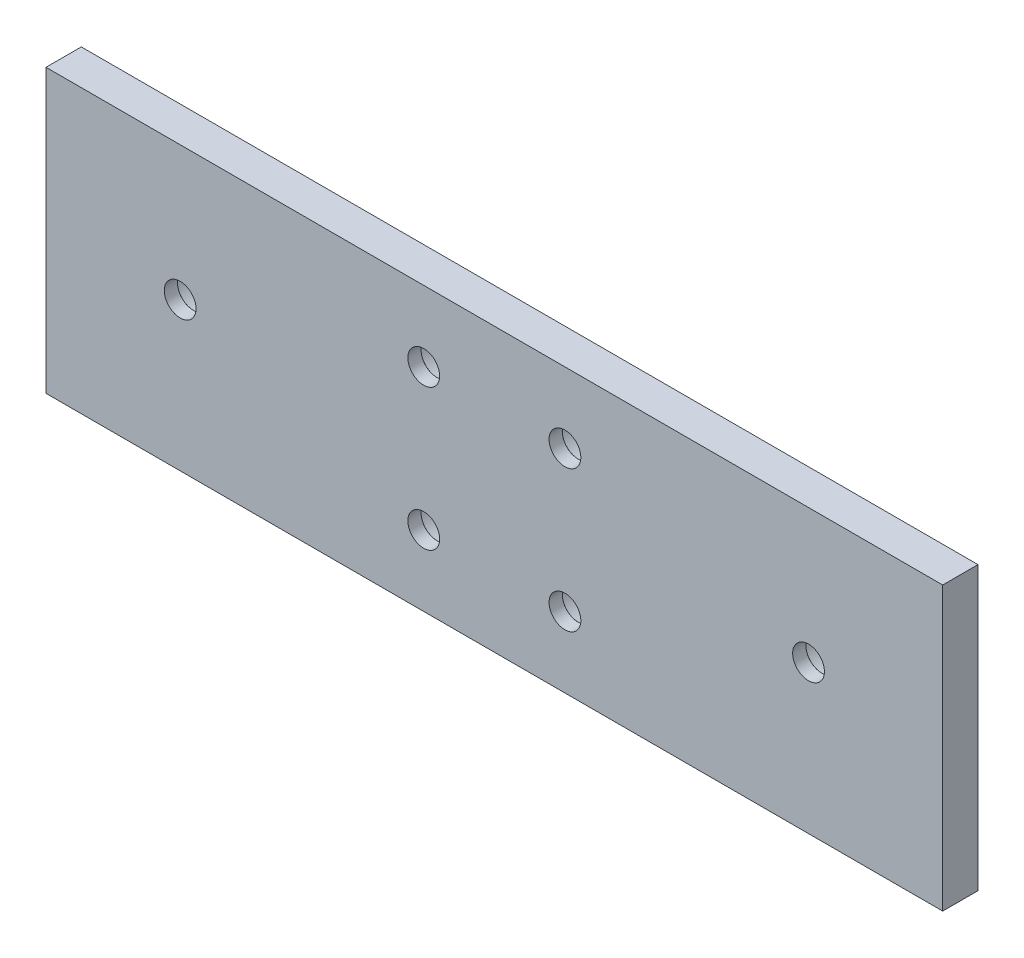
ISO-10303-21;
HEADER;
FILE_DESCRIPTION(('STEP AP214'),'2;1');
FILE_NAME('part.step','',(''),(''),'','','');
FILE_SCHEMA(('AUTOMOTIVE_DESIGN { 1 0 10303 214 1 1 1 1 }'));
ENDSEC;
DATA;
#1=APPLICATION_CONTEXT('core data for automotive mechanical design processes');
#2=APPLICATION_PROTOCOL_DEFINITION('international standard','automotive_design',2000,#1);
#3=PRODUCT_CONTEXT('',#1,'mechanical');
#4=PRODUCT('Part','Part','',(#3));
#5=PRODUCT_RELATED_PRODUCT_CATEGORY('part','',(#4));
#6=PRODUCT_DEFINITION_FORMATION('','',#4);
#7=PRODUCT_DEFINITION_CONTEXT('part definition',#1,'design');
#8=PRODUCT_DEFINITION('design','',#6,#7);
#9=PRODUCT_DEFINITION_SHAPE('','',#8);
#10=(LENGTH_UNIT() NAMED_UNIT(*) SI_UNIT(.MILLI.,.METRE.));
#11=(NAMED_UNIT(*) PLANE_ANGLE_UNIT() SI_UNIT($,.RADIAN.));
#12=(NAMED_UNIT(*) SI_UNIT($,.STERADIAN.) SOLID_ANGLE_UNIT());
#13=UNCERTAINTY_MEASURE_WITH_UNIT(LENGTH_MEASURE(1.E-05),#10,'distance_accuracy_value','');
#14=(GEOMETRIC_REPRESENTATION_CONTEXT(3) GLOBAL_UNCERTAINTY_ASSIGNED_CONTEXT((#13)) GLOBAL_UNIT_ASSIGNED_CONTEXT((#10,
#11,#12)) REPRESENTATION_CONTEXT('',''));
#15=CARTESIAN_POINT('',(0.,0.,0.));
#16=DIRECTION('',(0.,0.,1.));
#17=DIRECTION('',(1.,0.,0.));
#18=AXIS2_PLACEMENT_3D('',#15,#16,#17);
#19=CARTESIAN_POINT('',(63.5,-20.,5.));
#20=DIRECTION('',(-1.,0.,0.));
#21=DIRECTION('',(0.,0.,1.));
#22=AXIS2_PLACEMENT_3D('',#19,#20,#21);
#23=PLANE('',#22);
#24=DIRECTION('',(0.,1.,0.));
#25=VECTOR('',#24,1.);
#26=CARTESIAN_POINT('',(63.5,-20.,0.));
#27=LINE('',#26,#25);
#28=CARTESIAN_POINT('',(63.5,-20.,0.));
#29=VERTEX_POINT('',#28);
#30=CARTESIAN_POINT('',(63.5,20.,0.));
#31=VERTEX_POINT('',#30);
#32=EDGE_CURVE('E97',#29,#31,#27,.T.);
#33=ORIENTED_EDGE('',*,*,#32,.T.);
#34=DIRECTION('',(0.,0.,-1.));
#35=VECTOR('',#34,1.);
#36=CARTESIAN_POINT('',(63.5,20.,5.));
#37=LINE('',#36,#35);
#38=CARTESIAN_POINT('',(63.5,20.,5.));
#39=VERTEX_POINT('',#38);
#40=EDGE_CURVE('E11',#39,#31,#37,.T.);
#41=ORIENTED_EDGE('',*,*,#40,.F.);
#42=DIRECTION('',(0.,1.,0.));
#43=VECTOR('',#42,1.);
#44=CARTESIAN_POINT('',(63.5,-20.,5.));
#45=LINE('',#44,#43);
#46=CARTESIAN_POINT('',(63.5,-20.,5.));
#47=VERTEX_POINT('',#46);
#48=EDGE_CURVE('E85',#47,#39,#45,.T.);
#49=ORIENTED_EDGE('',*,*,#48,.F.);
#50=DIRECTION('',(0.,0.,-1.));
#51=VECTOR('',#50,1.);
#52=CARTESIAN_POINT('',(63.5,-20.,5.));
#53=LINE('',#52,#51);
#54=EDGE_CURVE('E93',#47,#29,#53,.T.);
#55=ORIENTED_EDGE('',*,*,#54,.T.);
#56=EDGE_LOOP('',(#33,#41,#49,#55));
#57=FACE_BOUND('',#56,.T.);
#58=ADVANCED_FACE('F34',(#57),#23,.F.);
#59=CARTESIAN_POINT('',(-63.5,20.,5.));
#60=DIRECTION('',(0.,-1.,0.));
#61=DIRECTION('',(0.,0.,-1.));
#62=AXIS2_PLACEMENT_3D('',#59,#60,#61);
#63=PLANE('',#62);
#64=DIRECTION('',(-1.,0.,0.));
#65=VECTOR('',#64,1.);
#66=CARTESIAN_POINT('',(-63.5,20.,0.));
#67=LINE('',#66,#65);
#68=CARTESIAN_POINT('',(-63.5,20.,0.));
#69=VERTEX_POINT('',#68);
#70=EDGE_CURVE('E89',#31,#69,#67,.T.);
#71=ORIENTED_EDGE('',*,*,#70,.T.);
#72=DIRECTION('',(0.,0.,-1.));
#73=VECTOR('',#72,1.);
#74=CARTESIAN_POINT('',(-63.5,20.,5.));
#75=LINE('',#74,#73);
#76=CARTESIAN_POINT('',(-63.5,20.,5.));
#77=VERTEX_POINT('',#76);
#78=EDGE_CURVE('E42',#77,#69,#75,.T.);
#79=ORIENTED_EDGE('',*,*,#78,.F.);
#80=DIRECTION('',(-1.,0.,0.));
#81=VECTOR('',#80,1.);
#82=CARTESIAN_POINT('',(-63.5,20.,5.));
#83=LINE('',#82,#81);
#84=EDGE_CURVE('E80',#39,#77,#83,.T.);
#85=ORIENTED_EDGE('',*,*,#84,.F.);
#86=ORIENTED_EDGE('',*,*,#40,.T.);
#87=EDGE_LOOP('',(#71,#79,#85,#86));
#88=FACE_BOUND('',#87,.T.);
#89=ADVANCED_FACE('F88',(#88),#63,.F.);
#90=CARTESIAN_POINT('',(-63.5,-20.,5.));
#91=DIRECTION('',(1.,0.,0.));
#92=DIRECTION('',(0.,0.,-1.));
#93=AXIS2_PLACEMENT_3D('',#90,#91,#92);
#94=PLANE('',#93);
#95=DIRECTION('',(0.,-1.,0.));
#96=VECTOR('',#95,1.);
#97=CARTESIAN_POINT('',(-63.5,-20.,0.));
#98=LINE('',#97,#96);
#99=CARTESIAN_POINT('',(-63.5,-20.,0.));
#100=VERTEX_POINT('',#99);
#101=EDGE_CURVE('E67',#69,#100,#98,.T.);
#102=ORIENTED_EDGE('',*,*,#101,.T.);
#103=DIRECTION('',(0.,0.,-1.));
#104=VECTOR('',#103,1.);
#105=CARTESIAN_POINT('',(-63.5,-20.,5.));
#106=LINE('',#105,#104);
#107=CARTESIAN_POINT('',(-63.5,-20.,5.));
#108=VERTEX_POINT('',#107);
#109=EDGE_CURVE('E90',#108,#100,#106,.T.);
#110=ORIENTED_EDGE('',*,*,#109,.F.);
#111=DIRECTION('',(0.,-1.,0.));
#112=VECTOR('',#111,1.);
#113=CARTESIAN_POINT('',(-63.5,-20.,5.));
#114=LINE('',#113,#112);
#115=EDGE_CURVE('E83',#77,#108,#114,.T.);
#116=ORIENTED_EDGE('',*,*,#115,.F.);
#117=ORIENTED_EDGE('',*,*,#78,.T.);
#118=EDGE_LOOP('',(#102,#110,#116,#117));
#119=FACE_BOUND('',#118,.T.);
#120=ADVANCED_FACE('F91',(#119),#94,.F.);
#121=CARTESIAN_POINT('',(-63.5,-20.,5.));
#122=DIRECTION('',(0.,1.,0.));
#123=DIRECTION('',(0.,0.,1.));
#124=AXIS2_PLACEMENT_3D('',#121,#122,#123);
#125=PLANE('',#124);
#126=DIRECTION('',(1.,0.,0.));
#127=VECTOR('',#126,1.);
#128=CARTESIAN_POINT('',(-63.5,-20.,0.));
#129=LINE('',#128,#127);
#130=EDGE_CURVE('E73',#100,#29,#129,.T.);
#131=ORIENTED_EDGE('',*,*,#130,.T.);
#132=ORIENTED_EDGE('',*,*,#54,.F.);
#133=DIRECTION('',(1.,0.,0.));
#134=VECTOR('',#133,1.);
#135=CARTESIAN_POINT('',(-63.5,-20.,5.));
#136=LINE('',#135,#134);
#137=EDGE_CURVE('E50',#108,#47,#136,.T.);
#138=ORIENTED_EDGE('',*,*,#137,.F.);
#139=ORIENTED_EDGE('',*,*,#109,.T.);
#140=EDGE_LOOP('',(#131,#132,#138,#139));
#141=FACE_BOUND('',#140,.T.);
#142=ADVANCED_FACE('F105',(#141),#125,.F.);
#143=CARTESIAN_POINT('',(0.,0.,5.));
#144=DIRECTION('',(0.,0.,-1.));
#145=DIRECTION('',(-1.,0.,0.));
#146=AXIS2_PLACEMENT_3D('',#143,#144,#145);
#147=PLANE('',#146);
#148=CARTESIAN_POINT('',(9.99999999999822,-9.99999999999679,5.));
#149=DIRECTION('',(0.,0.,-1.));
#150=DIRECTION('',(-1.,0.,0.));
#151=AXIS2_PLACEMENT_3D('',#148,#149,#150);
#152=CIRCLE('',#151,2.25);
#153=CARTESIAN_POINT('',(7.74999999999822,-9.99999999999679,5.));
#154=VERTEX_POINT('',#153);
#155=EDGE_CURVE('E185',#154,#154,#152,.T.);
#156=ORIENTED_EDGE('',*,*,#155,.T.);
#157=EDGE_LOOP('',(#156));
#158=FACE_BOUND('',#157,.T.);
#159=CARTESIAN_POINT('',(9.99999999999841,10.0000000000032,5.));
#160=DIRECTION('',(0.,0.,-1.));
#161=DIRECTION('',(-1.,0.,0.));
#162=AXIS2_PLACEMENT_3D('',#159,#160,#161);
#163=CIRCLE('',#162,2.25);
#164=CARTESIAN_POINT('',(7.74999999999841,10.0000000000032,5.));
#165=VERTEX_POINT('',#164);
#166=EDGE_CURVE('E170',#165,#165,#163,.T.);
#167=ORIENTED_EDGE('',*,*,#166,.T.);
#168=EDGE_LOOP('',(#167));
#169=FACE_BOUND('',#168,.T.);
#170=CARTESIAN_POINT('',(-10.0000000000018,-9.99999999999661,5.));
#171=DIRECTION('',(0.,0.,-1.));
#172=DIRECTION('',(-1.,0.,0.));
#173=AXIS2_PLACEMENT_3D('',#170,#171,#172);
#174=CIRCLE('',#173,2.25);
#175=CARTESIAN_POINT('',(-12.2500000000018,-9.99999999999661,5.));
#176=VERTEX_POINT('',#175);
#177=EDGE_CURVE('E155',#176,#176,#174,.T.);
#178=ORIENTED_EDGE('',*,*,#177,.T.);
#179=EDGE_LOOP('',(#178));
#180=FACE_BOUND('',#179,.T.);
#181=CARTESIAN_POINT('',(-10.0000000000016,10.0000000000034,5.));
#182=DIRECTION('',(0.,0.,-1.));
#183=DIRECTION('',(-1.,0.,0.));
#184=AXIS2_PLACEMENT_3D('',#181,#182,#183);
#185=CIRCLE('',#184,2.25);
#186=CARTESIAN_POINT('',(-12.2500000000016,10.0000000000034,5.));
#187=VERTEX_POINT('',#186);
#188=EDGE_CURVE('E140',#187,#187,#185,.T.);
#189=ORIENTED_EDGE('',*,*,#188,.T.);
#190=EDGE_LOOP('',(#189));
#191=FACE_BOUND('',#190,.T.);
#192=CARTESIAN_POINT('',(44.4999999999907,1.00000000000008,5.));
#193=DIRECTION('',(0.,0.,-1.));
#194=DIRECTION('',(-1.,0.,0.));
#195=AXIS2_PLACEMENT_3D('',#192,#193,#194);
#196=CIRCLE('',#195,2.25);
#197=CARTESIAN_POINT('',(42.2499999999907,1.00000000000008,5.));
#198=VERTEX_POINT('',#197);
#199=EDGE_CURVE('E125',#198,#198,#196,.T.);
#200=ORIENTED_EDGE('',*,*,#199,.T.);
#201=EDGE_LOOP('',(#200));
#202=FACE_BOUND('',#201,.T.);
#203=CARTESIAN_POINT('',(-44.5000000000093,0.999999999999977,5.));
#204=DIRECTION('',(0.,0.,-1.));
#205=DIRECTION('',(-1.,0.,0.));
#206=AXIS2_PLACEMENT_3D('',#203,#204,#205);
#207=CIRCLE('',#206,2.25);
#208=CARTESIAN_POINT('',(-46.7500000000093,0.999999999999977,5.));
#209=VERTEX_POINT('',#208);
#210=EDGE_CURVE('E100',#209,#209,#207,.T.);
#211=ORIENTED_EDGE('',*,*,#210,.T.);
#212=EDGE_LOOP('',(#211));
#213=FACE_BOUND('',#212,.T.);
#214=ORIENTED_EDGE('',*,*,#48,.T.);
#215=ORIENTED_EDGE('',*,*,#84,.T.);
#216=ORIENTED_EDGE('',*,*,#115,.T.);
#217=ORIENTED_EDGE('',*,*,#137,.T.);
#218=EDGE_LOOP('',(#214,#215,#216,#217));
#219=FACE_BOUND('',#218,.T.);
#220=ADVANCED_FACE('F81',(#158,#169,#180,#191,#202,#213,#219),#147,.F.);
#221=CARTESIAN_POINT('',(0.,0.,0.));
#222=DIRECTION('',(0.,0.,-1.));
#223=DIRECTION('',(-1.,0.,0.));
#224=AXIS2_PLACEMENT_3D('',#221,#222,#223);
#225=PLANE('',#224);
#226=CARTESIAN_POINT('',(9.99999999999822,-9.99999999999679,0.));
#227=DIRECTION('',(0.,0.,-1.));
#228=DIRECTION('',(-1.,0.,0.));
#229=AXIS2_PLACEMENT_3D('',#226,#227,#228);
#230=CIRCLE('',#229,4.49999999999999);
#231=CARTESIAN_POINT('',(5.49999999999823,-9.99999999999679,0.));
#232=VERTEX_POINT('',#231);
#233=EDGE_CURVE('E197',#232,#232,#230,.T.);
#234=ORIENTED_EDGE('',*,*,#233,.F.);
#235=EDGE_LOOP('',(#234));
#236=FACE_BOUND('',#235,.T.);
#237=CARTESIAN_POINT('',(9.99999999999841,10.0000000000032,0.));
#238=DIRECTION('',(0.,0.,-1.));
#239=DIRECTION('',(-1.,0.,0.));
#240=AXIS2_PLACEMENT_3D('',#237,#238,#239);
#241=CIRCLE('',#240,4.49999999999999);
#242=CARTESIAN_POINT('',(5.49999999999841,10.0000000000032,0.));
#243=VERTEX_POINT('',#242);
#244=EDGE_CURVE('E182',#243,#243,#241,.T.);
#245=ORIENTED_EDGE('',*,*,#244,.F.);
#246=EDGE_LOOP('',(#245));
#247=FACE_BOUND('',#246,.T.);
#248=CARTESIAN_POINT('',(-10.0000000000018,-9.99999999999661,0.));
#249=DIRECTION('',(0.,0.,-1.));
#250=DIRECTION('',(-1.,0.,0.));
#251=AXIS2_PLACEMENT_3D('',#248,#249,#250);
#252=CIRCLE('',#251,4.49999999999999);
#253=CARTESIAN_POINT('',(-14.5000000000018,-9.99999999999661,0.));
#254=VERTEX_POINT('',#253);
#255=EDGE_CURVE('E167',#254,#254,#252,.T.);
#256=ORIENTED_EDGE('',*,*,#255,.F.);
#257=EDGE_LOOP('',(#256));
#258=FACE_BOUND('',#257,.T.);
#259=CARTESIAN_POINT('',(-10.0000000000016,10.0000000000034,0.));
#260=DIRECTION('',(0.,0.,-1.));
#261=DIRECTION('',(-1.,0.,0.));
#262=AXIS2_PLACEMENT_3D('',#259,#260,#261);
#263=CIRCLE('',#262,4.49999999999999);
#264=CARTESIAN_POINT('',(-14.5000000000016,10.0000000000034,0.));
#265=VERTEX_POINT('',#264);
#266=EDGE_CURVE('E152',#265,#265,#263,.T.);
#267=ORIENTED_EDGE('',*,*,#266,.F.);
#268=EDGE_LOOP('',(#267));
#269=FACE_BOUND('',#268,.T.);
#270=CARTESIAN_POINT('',(44.4999999999907,1.00000000000008,0.));
#271=DIRECTION('',(0.,0.,-1.));
#272=DIRECTION('',(-1.,0.,0.));
#273=AXIS2_PLACEMENT_3D('',#270,#271,#272);
#274=CIRCLE('',#273,4.5);
#275=CARTESIAN_POINT('',(39.9999999999907,1.00000000000008,0.));
#276=VERTEX_POINT('',#275);
#277=EDGE_CURVE('E137',#276,#276,#274,.T.);
#278=ORIENTED_EDGE('',*,*,#277,.F.);
#279=EDGE_LOOP('',(#278));
#280=FACE_BOUND('',#279,.T.);
#281=CARTESIAN_POINT('',(-44.5000000000093,0.999999999999977,0.));
#282=DIRECTION('',(0.,0.,-1.));
#283=DIRECTION('',(-1.,0.,0.));
#284=AXIS2_PLACEMENT_3D('',#281,#282,#283);
#285=CIRCLE('',#284,4.5);
#286=CARTESIAN_POINT('',(-49.0000000000093,0.999999999999977,0.));
#287=VERTEX_POINT('',#286);
#288=EDGE_CURVE('E122',#287,#287,#285,.T.);
#289=ORIENTED_EDGE('',*,*,#288,.F.);
#290=EDGE_LOOP('',(#289));
#291=FACE_BOUND('',#290,.T.);
#292=ORIENTED_EDGE('',*,*,#32,.F.);
#293=ORIENTED_EDGE('',*,*,#130,.F.);
#294=ORIENTED_EDGE('',*,*,#101,.F.);
#295=ORIENTED_EDGE('',*,*,#70,.F.);
#296=EDGE_LOOP('',(#292,#293,#294,#295));
#297=FACE_BOUND('',#296,.T.);
#298=ADVANCED_FACE('F108',(#236,#247,#258,#269,#280,#291,#297),#225,.T.);
#299=CARTESIAN_POINT('',(-44.5000000000093,0.999999999999977,0.));
#300=DIRECTION('',(0.,0.,-1.));
#301=DIRECTION('',(-1.,0.,0.));
#302=AXIS2_PLACEMENT_3D('',#299,#300,#301);
#303=CYLINDRICAL_SURFACE('',#302,2.25);
#304=ORIENTED_EDGE('',*,*,#210,.F.);
#305=EDGE_LOOP('',(#304));
#306=FACE_BOUND('',#305,.T.);
#307=CARTESIAN_POINT('',(-44.5000000000093,0.999999999999977,3.125));
#308=DIRECTION('',(0.,0.,-1.));
#309=DIRECTION('',(-1.,0.,0.));
#310=AXIS2_PLACEMENT_3D('',#307,#308,#309);
#311=CIRCLE('',#310,2.25);
#312=CARTESIAN_POINT('',(-46.7500000000093,0.999999999999977,3.125));
#313=VERTEX_POINT('',#312);
#314=EDGE_CURVE('E113',#313,#313,#311,.T.);
#315=ORIENTED_EDGE('',*,*,#314,.T.);
#316=EDGE_LOOP('',(#315));
#317=FACE_BOUND('',#316,.T.);
#318=ADVANCED_FACE('F205',(#306,#317),#303,.F.);
#319=CARTESIAN_POINT('',(-44.5000000000093,0.999999999999977,3.1));
#320=DIRECTION('',(0.,0.,-1.));
#321=DIRECTION('',(-1.,0.,0.));
#322=AXIS2_PLACEMENT_3D('',#319,#320,#321);
#323=CONICAL_SURFACE('',#322,2.275,0.78539816339744);
#324=ORIENTED_EDGE('',*,*,#314,.F.);
#325=EDGE_LOOP('',(#324));
#326=FACE_BOUND('',#325,.T.);
#327=CARTESIAN_POINT('',(-44.5000000000093,0.999999999999977,3.1));
#328=DIRECTION('',(0.,0.,-1.));
#329=DIRECTION('',(-1.,0.,0.));
#330=AXIS2_PLACEMENT_3D('',#327,#328,#329);
#331=CIRCLE('',#330,2.275);
#332=CARTESIAN_POINT('',(-46.7750000000093,0.999999999999977,3.1));
#333=VERTEX_POINT('',#332);
#334=EDGE_CURVE('E116',#333,#333,#331,.T.);
#335=ORIENTED_EDGE('',*,*,#334,.T.);
#336=EDGE_LOOP('',(#335));
#337=FACE_BOUND('',#336,.T.);
#338=ADVANCED_FACE('F230',(#326,#337),#323,.F.);
#339=CARTESIAN_POINT('',(-42.2250000000093,0.999999999999977,3.1));
#340=DIRECTION('',(0.,0.,1.));
#341=DIRECTION('',(1.,0.,0.));
#342=AXIS2_PLACEMENT_3D('',#339,#340,#341);
#343=PLANE('',#342);
#344=ORIENTED_EDGE('',*,*,#334,.F.);
#345=EDGE_LOOP('',(#344));
#346=FACE_BOUND('',#345,.T.);
#347=CARTESIAN_POINT('',(-44.5000000000093,0.999999999999977,3.1));
#348=DIRECTION('',(0.,0.,-1.));
#349=DIRECTION('',(-1.,0.,0.));
#350=AXIS2_PLACEMENT_3D('',#347,#348,#349);
#351=CIRCLE('',#350,4.5);
#352=CARTESIAN_POINT('',(-49.0000000000093,0.999999999999977,3.1));
#353=VERTEX_POINT('',#352);
#354=EDGE_CURVE('E119',#353,#353,#351,.T.);
#355=ORIENTED_EDGE('',*,*,#354,.T.);
#356=EDGE_LOOP('',(#355));
#357=FACE_BOUND('',#356,.T.);
#358=ADVANCED_FACE('F220',(#346,#357),#343,.F.);
#359=CARTESIAN_POINT('',(-44.5000000000093,0.999999999999977,0.));
#360=DIRECTION('',(0.,0.,-1.));
#361=DIRECTION('',(-1.,0.,0.));
#362=AXIS2_PLACEMENT_3D('',#359,#360,#361);
#363=CYLINDRICAL_SURFACE('',#362,4.5);
#364=ORIENTED_EDGE('',*,*,#354,.F.);
#365=EDGE_LOOP('',(#364));
#366=FACE_BOUND('',#365,.T.);
#367=ORIENTED_EDGE('',*,*,#288,.T.);
#368=EDGE_LOOP('',(#367));
#369=FACE_BOUND('',#368,.T.);
#370=ADVANCED_FACE('F217',(#366,#369),#363,.F.);
#371=CARTESIAN_POINT('',(44.4999999999907,1.00000000000008,0.));
#372=DIRECTION('',(0.,0.,-1.));
#373=DIRECTION('',(-1.,0.,0.));
#374=AXIS2_PLACEMENT_3D('',#371,#372,#373);
#375=CYLINDRICAL_SURFACE('',#374,2.25);
#376=ORIENTED_EDGE('',*,*,#199,.F.);
#377=EDGE_LOOP('',(#376));
#378=FACE_BOUND('',#377,.T.);
#379=CARTESIAN_POINT('',(44.4999999999907,1.00000000000008,3.125));
#380=DIRECTION('',(0.,0.,-1.));
#381=DIRECTION('',(-1.,0.,0.));
#382=AXIS2_PLACEMENT_3D('',#379,#380,#381);
#383=CIRCLE('',#382,2.25);
#384=CARTESIAN_POINT('',(42.2499999999907,1.00000000000008,3.125));
#385=VERTEX_POINT('',#384);
#386=EDGE_CURVE('E128',#385,#385,#383,.T.);
#387=ORIENTED_EDGE('',*,*,#386,.T.);
#388=EDGE_LOOP('',(#387));
#389=FACE_BOUND('',#388,.T.);
#390=ADVANCED_FACE('F219',(#378,#389),#375,.F.);
#391=CARTESIAN_POINT('',(44.4999999999907,1.00000000000008,3.1));
#392=DIRECTION('',(0.,0.,-1.));
#393=DIRECTION('',(-1.,0.,0.));
#394=AXIS2_PLACEMENT_3D('',#391,#392,#393);
#395=CONICAL_SURFACE('',#394,2.275,0.78539816339744);
#396=ORIENTED_EDGE('',*,*,#386,.F.);
#397=EDGE_LOOP('',(#396));
#398=FACE_BOUND('',#397,.T.);
#399=CARTESIAN_POINT('',(44.4999999999907,1.00000000000008,3.1));
#400=DIRECTION('',(0.,0.,-1.));
#401=DIRECTION('',(-1.,0.,0.));
#402=AXIS2_PLACEMENT_3D('',#399,#400,#401);
#403=CIRCLE('',#402,2.275);
#404=CARTESIAN_POINT('',(42.2249999999907,1.00000000000008,3.1));
#405=VERTEX_POINT('',#404);
#406=EDGE_CURVE('E131',#405,#405,#403,.T.);
#407=ORIENTED_EDGE('',*,*,#406,.T.);
#408=EDGE_LOOP('',(#407));
#409=FACE_BOUND('',#408,.T.);
#410=ADVANCED_FACE('F227',(#398,#409),#395,.F.);
#411=CARTESIAN_POINT('',(46.7749999999907,1.00000000000008,3.1));
#412=DIRECTION('',(0.,0.,1.));
#413=DIRECTION('',(1.,0.,0.));
#414=AXIS2_PLACEMENT_3D('',#411,#412,#413);
#415=PLANE('',#414);
#416=ORIENTED_EDGE('',*,*,#406,.F.);
#417=EDGE_LOOP('',(#416));
#418=FACE_BOUND('',#417,.T.);
#419=CARTESIAN_POINT('',(44.4999999999907,1.00000000000008,3.1));
#420=DIRECTION('',(0.,0.,-1.));
#421=DIRECTION('',(-1.,0.,0.));
#422=AXIS2_PLACEMENT_3D('',#419,#420,#421);
#423=CIRCLE('',#422,4.5);
#424=CARTESIAN_POINT('',(39.9999999999907,1.00000000000008,3.1));
#425=VERTEX_POINT('',#424);
#426=EDGE_CURVE('E134',#425,#425,#423,.T.);
#427=ORIENTED_EDGE('',*,*,#426,.T.);
#428=EDGE_LOOP('',(#427));
#429=FACE_BOUND('',#428,.T.);
#430=ADVANCED_FACE('F285',(#418,#429),#415,.F.);
#431=CARTESIAN_POINT('',(44.4999999999907,1.00000000000008,0.));
#432=DIRECTION('',(0.,0.,-1.));
#433=DIRECTION('',(-1.,0.,0.));
#434=AXIS2_PLACEMENT_3D('',#431,#432,#433);
#435=CYLINDRICAL_SURFACE('',#434,4.5);
#436=ORIENTED_EDGE('',*,*,#426,.F.);
#437=EDGE_LOOP('',(#436));
#438=FACE_BOUND('',#437,.T.);
#439=ORIENTED_EDGE('',*,*,#277,.T.);
#440=EDGE_LOOP('',(#439));
#441=FACE_BOUND('',#440,.T.);
#442=ADVANCED_FACE('F295',(#438,#441),#435,.F.);
#443=CARTESIAN_POINT('',(-10.0000000000016,10.0000000000034,0.));
#444=DIRECTION('',(0.,0.,-1.));
#445=DIRECTION('',(-1.,0.,0.));
#446=AXIS2_PLACEMENT_3D('',#443,#444,#445);
#447=CYLINDRICAL_SURFACE('',#446,2.25);
#448=ORIENTED_EDGE('',*,*,#188,.F.);
#449=EDGE_LOOP('',(#448));
#450=FACE_BOUND('',#449,.T.);
#451=CARTESIAN_POINT('',(-10.0000000000016,10.0000000000034,3.125));
#452=DIRECTION('',(0.,0.,-1.));
#453=DIRECTION('',(-1.,0.,0.));
#454=AXIS2_PLACEMENT_3D('',#451,#452,#453);
#455=CIRCLE('',#454,2.25);
#456=CARTESIAN_POINT('',(-12.2500000000016,10.0000000000034,3.125));
#457=VERTEX_POINT('',#456);
#458=EDGE_CURVE('E143',#457,#457,#455,.T.);
#459=ORIENTED_EDGE('',*,*,#458,.T.);
#460=EDGE_LOOP('',(#459));
#461=FACE_BOUND('',#460,.T.);
#462=ADVANCED_FACE('F305',(#450,#461),#447,.F.);
#463=CARTESIAN_POINT('',(-10.0000000000016,10.0000000000034,3.1));
#464=DIRECTION('',(0.,0.,-1.));
#465=DIRECTION('',(-1.,0.,0.));
#466=AXIS2_PLACEMENT_3D('',#463,#464,#465);
#467=CONICAL_SURFACE('',#466,2.275,0.785398163397483);
#468=ORIENTED_EDGE('',*,*,#458,.F.);
#469=EDGE_LOOP('',(#468));
#470=FACE_BOUND('',#469,.T.);
#471=CARTESIAN_POINT('',(-10.0000000000016,10.0000000000034,3.1));
#472=DIRECTION('',(0.,0.,-1.));
#473=DIRECTION('',(-1.,0.,0.));
#474=AXIS2_PLACEMENT_3D('',#471,#472,#473);
#475=CIRCLE('',#474,2.275);
#476=CARTESIAN_POINT('',(-12.2750000000016,10.0000000000034,3.1));
#477=VERTEX_POINT('',#476);
#478=EDGE_CURVE('E146',#477,#477,#475,.T.);
#479=ORIENTED_EDGE('',*,*,#478,.T.);
#480=EDGE_LOOP('',(#479));
#481=FACE_BOUND('',#480,.T.);
#482=ADVANCED_FACE('F329',(#470,#481),#467,.F.);
#483=CARTESIAN_POINT('',(-7.72500000000159,10.0000000000034,3.1));
#484=DIRECTION('',(0.,0.,1.));
#485=DIRECTION('',(1.,0.,0.));
#486=AXIS2_PLACEMENT_3D('',#483,#484,#485);
#487=PLANE('',#486);
#488=ORIENTED_EDGE('',*,*,#478,.F.);
#489=EDGE_LOOP('',(#488));
#490=FACE_BOUND('',#489,.T.);
#491=CARTESIAN_POINT('',(-10.0000000000016,10.0000000000034,3.1));
#492=DIRECTION('',(0.,0.,-1.));
#493=DIRECTION('',(-1.,0.,0.));
#494=AXIS2_PLACEMENT_3D('',#491,#492,#493);
#495=CIRCLE('',#494,4.49999999999999);
#496=CARTESIAN_POINT('',(-14.5000000000016,10.0000000000034,3.1));
#497=VERTEX_POINT('',#496);
#498=EDGE_CURVE('E149',#497,#497,#495,.T.);
#499=ORIENTED_EDGE('',*,*,#498,.T.);
#500=EDGE_LOOP('',(#499));
#501=FACE_BOUND('',#500,.T.);
#502=ADVANCED_FACE('F339',(#490,#501),#487,.F.);
#503=CARTESIAN_POINT('',(-10.0000000000016,10.0000000000034,0.));
#504=DIRECTION('',(0.,0.,-1.));
#505=DIRECTION('',(-1.,0.,0.));
#506=AXIS2_PLACEMENT_3D('',#503,#504,#505);
#507=CYLINDRICAL_SURFACE('',#506,4.49999999999999);
#508=ORIENTED_EDGE('',*,*,#498,.F.);
#509=EDGE_LOOP('',(#508));
#510=FACE_BOUND('',#509,.T.);
#511=ORIENTED_EDGE('',*,*,#266,.T.);
#512=EDGE_LOOP('',(#511));
#513=FACE_BOUND('',#512,.T.);
#514=ADVANCED_FACE('F349',(#510,#513),#507,.F.);
#515=CARTESIAN_POINT('',(-10.0000000000018,-9.99999999999661,0.));
#516=DIRECTION('',(0.,0.,-1.));
#517=DIRECTION('',(-1.,0.,0.));
#518=AXIS2_PLACEMENT_3D('',#515,#516,#517);
#519=CYLINDRICAL_SURFACE('',#518,2.25);
#520=ORIENTED_EDGE('',*,*,#177,.F.);
#521=EDGE_LOOP('',(#520));
#522=FACE_BOUND('',#521,.T.);
#523=CARTESIAN_POINT('',(-10.0000000000018,-9.99999999999661,3.125));
#524=DIRECTION('',(0.,0.,-1.));
#525=DIRECTION('',(-1.,0.,0.));
#526=AXIS2_PLACEMENT_3D('',#523,#524,#525);
#527=CIRCLE('',#526,2.25);
#528=CARTESIAN_POINT('',(-12.2500000000018,-9.99999999999661,3.125));
#529=VERTEX_POINT('',#528);
#530=EDGE_CURVE('E158',#529,#529,#527,.T.);
#531=ORIENTED_EDGE('',*,*,#530,.T.);
#532=EDGE_LOOP('',(#531));
#533=FACE_BOUND('',#532,.T.);
#534=ADVANCED_FACE('F359',(#522,#533),#519,.F.);
#535=CARTESIAN_POINT('',(-10.0000000000018,-9.99999999999661,3.1));
#536=DIRECTION('',(0.,0.,-1.));
#537=DIRECTION('',(-1.,0.,0.));
#538=AXIS2_PLACEMENT_3D('',#535,#536,#537);
#539=CONICAL_SURFACE('',#538,2.275,0.785398163397483);
#540=ORIENTED_EDGE('',*,*,#530,.F.);
#541=EDGE_LOOP('',(#540));
#542=FACE_BOUND('',#541,.T.);
#543=CARTESIAN_POINT('',(-10.0000000000018,-9.99999999999661,3.1));
#544=DIRECTION('',(0.,0.,-1.));
#545=DIRECTION('',(-1.,0.,0.));
#546=AXIS2_PLACEMENT_3D('',#543,#544,#545);
#547=CIRCLE('',#546,2.275);
#548=CARTESIAN_POINT('',(-12.2750000000018,-9.99999999999661,3.1));
#549=VERTEX_POINT('',#548);
#550=EDGE_CURVE('E161',#549,#549,#547,.T.);
#551=ORIENTED_EDGE('',*,*,#550,.T.);
#552=EDGE_LOOP('',(#551));
#553=FACE_BOUND('',#552,.T.);
#554=ADVANCED_FACE('F369',(#542,#553),#539,.F.);
#555=CARTESIAN_POINT('',(-7.72500000000178,-9.99999999999661,3.1));
#556=DIRECTION('',(0.,0.,1.));
#557=DIRECTION('',(1.,0.,0.));
#558=AXIS2_PLACEMENT_3D('',#555,#556,#557);
#559=PLANE('',#558);
#560=ORIENTED_EDGE('',*,*,#550,.F.);
#561=EDGE_LOOP('',(#560));
#562=FACE_BOUND('',#561,.T.);
#563=CARTESIAN_POINT('',(-10.0000000000018,-9.99999999999661,3.1));
#564=DIRECTION('',(0.,0.,-1.));
#565=DIRECTION('',(-1.,0.,0.));
#566=AXIS2_PLACEMENT_3D('',#563,#564,#565);
#567=CIRCLE('',#566,4.49999999999999);
#568=CARTESIAN_POINT('',(-14.5000000000018,-9.99999999999661,3.1));
#569=VERTEX_POINT('',#568);
#570=EDGE_CURVE('E164',#569,#569,#567,.T.);
#571=ORIENTED_EDGE('',*,*,#570,.T.);
#572=EDGE_LOOP('',(#571));
#573=FACE_BOUND('',#572,.T.);
#574=ADVANCED_FACE('F379',(#562,#573),#559,.F.);
#575=CARTESIAN_POINT('',(-10.0000000000018,-9.99999999999661,0.));
#576=DIRECTION('',(0.,0.,-1.));
#577=DIRECTION('',(-1.,0.,0.));
#578=AXIS2_PLACEMENT_3D('',#575,#576,#577);
#579=CYLINDRICAL_SURFACE('',#578,4.49999999999999);
#580=ORIENTED_EDGE('',*,*,#570,.F.);
#581=EDGE_LOOP('',(#580));
#582=FACE_BOUND('',#581,.T.);
#583=ORIENTED_EDGE('',*,*,#255,.T.);
#584=EDGE_LOOP('',(#583));
#585=FACE_BOUND('',#584,.T.);
#586=ADVANCED_FACE('F389',(#582,#585),#579,.F.);
#587=CARTESIAN_POINT('',(9.99999999999841,10.0000000000032,0.));
#588=DIRECTION('',(0.,0.,-1.));
#589=DIRECTION('',(-1.,0.,0.));
#590=AXIS2_PLACEMENT_3D('',#587,#588,#589);
#591=CYLINDRICAL_SURFACE('',#590,2.25);
#592=ORIENTED_EDGE('',*,*,#166,.F.);
#593=EDGE_LOOP('',(#592));
#594=FACE_BOUND('',#593,.T.);
#595=CARTESIAN_POINT('',(9.99999999999841,10.0000000000032,3.125));
#596=DIRECTION('',(0.,0.,-1.));
#597=DIRECTION('',(-1.,0.,0.));
#598=AXIS2_PLACEMENT_3D('',#595,#596,#597);
#599=CIRCLE('',#598,2.25);
#600=CARTESIAN_POINT('',(7.74999999999841,10.0000000000032,3.125));
#601=VERTEX_POINT('',#600);
#602=EDGE_CURVE('E173',#601,#601,#599,.T.);
#603=ORIENTED_EDGE('',*,*,#602,.T.);
#604=EDGE_LOOP('',(#603));
#605=FACE_BOUND('',#604,.T.);
#606=ADVANCED_FACE('F399',(#594,#605),#591,.F.);
#607=CARTESIAN_POINT('',(9.99999999999841,10.0000000000032,3.1));
#608=DIRECTION('',(0.,0.,-1.));
#609=DIRECTION('',(-1.,0.,0.));
#610=AXIS2_PLACEMENT_3D('',#607,#608,#609);
#611=CONICAL_SURFACE('',#610,2.275,0.785398163397483);
#612=ORIENTED_EDGE('',*,*,#602,.F.);
#613=EDGE_LOOP('',(#612));
#614=FACE_BOUND('',#613,.T.);
#615=CARTESIAN_POINT('',(9.99999999999841,10.0000000000032,3.1));
#616=DIRECTION('',(0.,0.,-1.));
#617=DIRECTION('',(-1.,0.,0.));
#618=AXIS2_PLACEMENT_3D('',#615,#616,#617);
#619=CIRCLE('',#618,2.275);
#620=CARTESIAN_POINT('',(7.72499999999841,10.0000000000032,3.1));
#621=VERTEX_POINT('',#620);
#622=EDGE_CURVE('E176',#621,#621,#619,.T.);
#623=ORIENTED_EDGE('',*,*,#622,.T.);
#624=EDGE_LOOP('',(#623));
#625=FACE_BOUND('',#624,.T.);
#626=ADVANCED_FACE('F409',(#614,#625),#611,.F.);
#627=CARTESIAN_POINT('',(12.2749999999984,10.0000000000032,3.1));
#628=DIRECTION('',(0.,0.,1.));
#629=DIRECTION('',(1.,0.,0.));
#630=AXIS2_PLACEMENT_3D('',#627,#628,#629);
#631=PLANE('',#630);
#632=ORIENTED_EDGE('',*,*,#622,.F.);
#633=EDGE_LOOP('',(#632));
#634=FACE_BOUND('',#633,.T.);
#635=CARTESIAN_POINT('',(9.99999999999841,10.0000000000032,3.1));
#636=DIRECTION('',(0.,0.,-1.));
#637=DIRECTION('',(-1.,0.,0.));
#638=AXIS2_PLACEMENT_3D('',#635,#636,#637);
#639=CIRCLE('',#638,4.49999999999999);
#640=CARTESIAN_POINT('',(5.49999999999841,10.0000000000032,3.1));
#641=VERTEX_POINT('',#640);
#642=EDGE_CURVE('E179',#641,#641,#639,.T.);
#643=ORIENTED_EDGE('',*,*,#642,.T.);
#644=EDGE_LOOP('',(#643));
#645=FACE_BOUND('',#644,.T.);
#646=ADVANCED_FACE('F419',(#634,#645),#631,.F.);
#647=CARTESIAN_POINT('',(9.99999999999841,10.0000000000032,0.));
#648=DIRECTION('',(0.,0.,-1.));
#649=DIRECTION('',(-1.,0.,0.));
#650=AXIS2_PLACEMENT_3D('',#647,#648,#649);
#651=CYLINDRICAL_SURFACE('',#650,4.49999999999999);
#652=ORIENTED_EDGE('',*,*,#642,.F.);
#653=EDGE_LOOP('',(#652));
#654=FACE_BOUND('',#653,.T.);
#655=ORIENTED_EDGE('',*,*,#244,.T.);
#656=EDGE_LOOP('',(#655));
#657=FACE_BOUND('',#656,.T.);
#658=ADVANCED_FACE('F429',(#654,#657),#651,.F.);
#659=CARTESIAN_POINT('',(9.99999999999822,-9.99999999999679,0.));
#660=DIRECTION('',(0.,0.,-1.));
#661=DIRECTION('',(-1.,0.,0.));
#662=AXIS2_PLACEMENT_3D('',#659,#660,#661);
#663=CYLINDRICAL_SURFACE('',#662,2.25);
#664=ORIENTED_EDGE('',*,*,#155,.F.);
#665=EDGE_LOOP('',(#664));
#666=FACE_BOUND('',#665,.T.);
#667=CARTESIAN_POINT('',(9.99999999999822,-9.99999999999679,3.125));
#668=DIRECTION('',(0.,0.,-1.));
#669=DIRECTION('',(-1.,0.,0.));
#670=AXIS2_PLACEMENT_3D('',#667,#668,#669);
#671=CIRCLE('',#670,2.25);
#672=CARTESIAN_POINT('',(7.74999999999822,-9.99999999999679,3.125));
#673=VERTEX_POINT('',#672);
#674=EDGE_CURVE('E188',#673,#673,#671,.T.);
#675=ORIENTED_EDGE('',*,*,#674,.T.);
#676=EDGE_LOOP('',(#675));
#677=FACE_BOUND('',#676,.T.);
#678=ADVANCED_FACE('F439',(#666,#677),#663,.F.);
#679=CARTESIAN_POINT('',(9.99999999999822,-9.99999999999679,3.1));
#680=DIRECTION('',(0.,0.,-1.));
#681=DIRECTION('',(-1.,0.,0.));
#682=AXIS2_PLACEMENT_3D('',#679,#680,#681);
#683=CONICAL_SURFACE('',#682,2.275,0.785398163397483);
#684=ORIENTED_EDGE('',*,*,#674,.F.);
#685=EDGE_LOOP('',(#684));
#686=FACE_BOUND('',#685,.T.);
#687=CARTESIAN_POINT('',(9.99999999999822,-9.99999999999679,3.1));
#688=DIRECTION('',(0.,0.,-1.));
#689=DIRECTION('',(-1.,0.,0.));
#690=AXIS2_PLACEMENT_3D('',#687,#688,#689);
#691=CIRCLE('',#690,2.275);
#692=CARTESIAN_POINT('',(7.72499999999822,-9.99999999999679,3.1));
#693=VERTEX_POINT('',#692);
#694=EDGE_CURVE('E191',#693,#693,#691,.T.);
#695=ORIENTED_EDGE('',*,*,#694,.T.);
#696=EDGE_LOOP('',(#695));
#697=FACE_BOUND('',#696,.T.);
#698=ADVANCED_FACE('F449',(#686,#697),#683,.F.);
#699=CARTESIAN_POINT('',(12.2749999999982,-9.99999999999679,3.1));
#700=DIRECTION('',(0.,0.,1.));
#701=DIRECTION('',(1.,0.,0.));
#702=AXIS2_PLACEMENT_3D('',#699,#700,#701);
#703=PLANE('',#702);
#704=ORIENTED_EDGE('',*,*,#694,.F.);
#705=EDGE_LOOP('',(#704));
#706=FACE_BOUND('',#705,.T.);
#707=CARTESIAN_POINT('',(9.99999999999822,-9.99999999999679,3.1));
#708=DIRECTION('',(0.,0.,-1.));
#709=DIRECTION('',(-1.,0.,0.));
#710=AXIS2_PLACEMENT_3D('',#707,#708,#709);
#711=CIRCLE('',#710,4.49999999999999);
#712=CARTESIAN_POINT('',(5.49999999999823,-9.99999999999679,3.1));
#713=VERTEX_POINT('',#712);
#714=EDGE_CURVE('E194',#713,#713,#711,.T.);
#715=ORIENTED_EDGE('',*,*,#714,.T.);
#716=EDGE_LOOP('',(#715));
#717=FACE_BOUND('',#716,.T.);
#718=ADVANCED_FACE('F459',(#706,#717),#703,.F.);
#719=CARTESIAN_POINT('',(9.99999999999822,-9.99999999999679,0.));
#720=DIRECTION('',(0.,0.,-1.));
#721=DIRECTION('',(-1.,0.,0.));
#722=AXIS2_PLACEMENT_3D('',#719,#720,#721);
#723=CYLINDRICAL_SURFACE('',#722,4.49999999999999);
#724=ORIENTED_EDGE('',*,*,#714,.F.);
#725=EDGE_LOOP('',(#724));
#726=FACE_BOUND('',#725,.T.);
#727=ORIENTED_EDGE('',*,*,#233,.T.);
#728=EDGE_LOOP('',(#727));
#729=FACE_BOUND('',#728,.T.);
#730=ADVANCED_FACE('F201',(#726,#729),#723,.F.);
#731=CLOSED_SHELL('',(#58,#89,#120,#142,#220,#298,#318,#338,#358,#370,#390,#410,#430,#442,#462,
#482,#502,#514,#534,#554,#574,#586,#606,#626,#646,#658,#678,#698,#718,#730));
#732=MANIFOLD_SOLID_BREP('B2',#731);
#733=ADVANCED_BREP_SHAPE_REPRESENTATION('',(#18,#732),#14);
#734=SHAPE_DEFINITION_REPRESENTATION(#9,#733);
ENDSEC;
END-ISO-10303-21;
